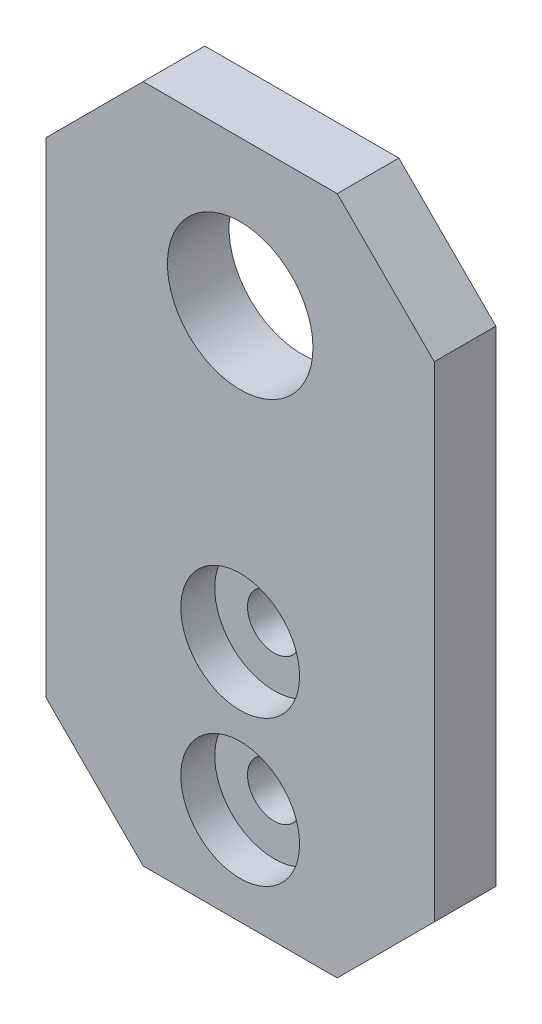
ISO-10303-21;
HEADER;
FILE_DESCRIPTION(('STEP AP214'),'2;1');
FILE_NAME('part.step','',(''),(''),'','','');
FILE_SCHEMA(('AUTOMOTIVE_DESIGN { 1 0 10303 214 1 1 1 1 }'));
ENDSEC;
DATA;
#1=APPLICATION_CONTEXT('core data for automotive mechanical design processes');
#2=APPLICATION_PROTOCOL_DEFINITION('international standard','automotive_design',2000,#1);
#3=PRODUCT_CONTEXT('',#1,'mechanical');
#4=PRODUCT('Part','Part','',(#3));
#5=PRODUCT_RELATED_PRODUCT_CATEGORY('part','',(#4));
#6=PRODUCT_DEFINITION_FORMATION('','',#4);
#7=PRODUCT_DEFINITION_CONTEXT('part definition',#1,'design');
#8=PRODUCT_DEFINITION('design','',#6,#7);
#9=PRODUCT_DEFINITION_SHAPE('','',#8);
#10=(LENGTH_UNIT() NAMED_UNIT(*) SI_UNIT(.MILLI.,.METRE.));
#11=(NAMED_UNIT(*) PLANE_ANGLE_UNIT() SI_UNIT($,.RADIAN.));
#12=(NAMED_UNIT(*) SI_UNIT($,.STERADIAN.) SOLID_ANGLE_UNIT());
#13=UNCERTAINTY_MEASURE_WITH_UNIT(LENGTH_MEASURE(1.E-05),#10,'distance_accuracy_value','');
#14=(GEOMETRIC_REPRESENTATION_CONTEXT(3) GLOBAL_UNCERTAINTY_ASSIGNED_CONTEXT((#13)) GLOBAL_UNIT_ASSIGNED_CONTEXT((#10,
#11,#12)) REPRESENTATION_CONTEXT('',''));
#15=CARTESIAN_POINT('',(0.,0.,0.));
#16=DIRECTION('',(0.,0.,1.));
#17=DIRECTION('',(1.,0.,0.));
#18=AXIS2_PLACEMENT_3D('',#15,#16,#17);
#19=CARTESIAN_POINT('',(0.,0.,6.35));
#20=DIRECTION('',(0.,0.,-1.));
#21=DIRECTION('',(-1.,0.,0.));
#22=AXIS2_PLACEMENT_3D('',#19,#20,#21);
#23=PLANE('',#22);
#24=CARTESIAN_POINT('',(0.,-25.,6.35));
#25=DIRECTION('',(0.,0.,1.));
#26=DIRECTION('',(1.,0.,0.));
#27=AXIS2_PLACEMENT_3D('',#24,#25,#26);
#28=CIRCLE('',#27,6.119);
#29=CARTESIAN_POINT('',(6.119,-25.,6.35));
#30=VERTEX_POINT('',#29);
#31=EDGE_CURVE('E229',#30,#30,#28,.T.);
#32=ORIENTED_EDGE('',*,*,#31,.F.);
#33=EDGE_LOOP('',(#32));
#34=FACE_BOUND('',#33,.T.);
#35=DIRECTION('',(1.,0.,0.));
#36=VECTOR('',#35,1.);
#37=CARTESIAN_POINT('',(-20.,-35.,6.35));
#38=LINE('',#37,#36);
#39=CARTESIAN_POINT('',(-10.,-35.,6.35));
#40=VERTEX_POINT('',#39);
#41=CARTESIAN_POINT('',(9.99999999999997,-35.,6.35));
#42=VERTEX_POINT('',#41);
#43=EDGE_CURVE('E192',#40,#42,#38,.T.);
#44=ORIENTED_EDGE('',*,*,#43,.T.);
#45=DIRECTION('',(-0.707106781186549,-0.707106781186546,0.));
#46=VECTOR('',#45,1.);
#47=CARTESIAN_POINT('',(20.,-25.,6.35));
#48=LINE('',#47,#46);
#49=CARTESIAN_POINT('',(20.,-25.,6.35));
#50=VERTEX_POINT('',#49);
#51=EDGE_CURVE('E178',#42,#50,#48,.F.);
#52=ORIENTED_EDGE('',*,*,#51,.T.);
#53=DIRECTION('',(0.,1.,0.));
#54=VECTOR('',#53,1.);
#55=CARTESIAN_POINT('',(20.,-35.,6.35));
#56=LINE('',#55,#54);
#57=CARTESIAN_POINT('',(20.,24.9999999999999,6.35));
#58=VERTEX_POINT('',#57);
#59=EDGE_CURVE('E135',#50,#58,#56,.T.);
#60=ORIENTED_EDGE('',*,*,#59,.T.);
#61=DIRECTION('',(0.707106781186546,-0.707106781186549,0.));
#62=VECTOR('',#61,1.);
#63=CARTESIAN_POINT('',(9.99999999999999,35.,6.35));
#64=LINE('',#63,#62);
#65=CARTESIAN_POINT('',(9.99999999999999,35.,6.35));
#66=VERTEX_POINT('',#65);
#67=EDGE_CURVE('E70',#58,#66,#64,.F.);
#68=ORIENTED_EDGE('',*,*,#67,.T.);
#69=DIRECTION('',(-1.,0.,0.));
#70=VECTOR('',#69,1.);
#71=CARTESIAN_POINT('',(-20.,35.,6.35));
#72=LINE('',#71,#70);
#73=CARTESIAN_POINT('',(-9.99999999999995,35.,6.35));
#74=VERTEX_POINT('',#73);
#75=EDGE_CURVE('E157',#66,#74,#72,.T.);
#76=ORIENTED_EDGE('',*,*,#75,.T.);
#77=DIRECTION('',(0.707106781186549,0.707106781186546,0.));
#78=VECTOR('',#77,1.);
#79=CARTESIAN_POINT('',(-20.,25.,6.35));
#80=LINE('',#79,#78);
#81=CARTESIAN_POINT('',(-20.,25.,6.35));
#82=VERTEX_POINT('',#81);
#83=EDGE_CURVE('E170',#74,#82,#80,.F.);
#84=ORIENTED_EDGE('',*,*,#83,.T.);
#85=DIRECTION('',(0.,-1.,0.));
#86=VECTOR('',#85,1.);
#87=CARTESIAN_POINT('',(-20.,-35.,6.35));
#88=LINE('',#87,#86);
#89=CARTESIAN_POINT('',(-20.,-25.,6.35));
#90=VERTEX_POINT('',#89);
#91=EDGE_CURVE('E150',#82,#90,#88,.T.);
#92=ORIENTED_EDGE('',*,*,#91,.T.);
#93=DIRECTION('',(-0.707106781186546,0.707106781186549,0.));
#94=VECTOR('',#93,1.);
#95=CARTESIAN_POINT('',(-9.99999999999999,-35.,6.35));
#96=LINE('',#95,#94);
#97=EDGE_CURVE('E175',#90,#40,#96,.F.);
#98=ORIENTED_EDGE('',*,*,#97,.T.);
#99=EDGE_LOOP('',(#44,#52,#60,#68,#76,#84,#92,#98));
#100=FACE_BOUND('',#99,.T.);
#101=CARTESIAN_POINT('',(0.,20.,6.35));
#102=DIRECTION('',(0.,0.,1.));
#103=DIRECTION('',(1.,0.,0.));
#104=AXIS2_PLACEMENT_3D('',#101,#102,#103);
#105=CIRCLE('',#104,7.5);
#106=CARTESIAN_POINT('',(7.5,20.,6.35));
#107=VERTEX_POINT('',#106);
#108=EDGE_CURVE('E206',#107,#107,#105,.T.);
#109=ORIENTED_EDGE('',*,*,#108,.F.);
#110=EDGE_LOOP('',(#109));
#111=FACE_BOUND('',#110,.T.);
#112=CARTESIAN_POINT('',(0.,-10.,6.35));
#113=DIRECTION('',(0.,0.,1.));
#114=DIRECTION('',(1.,0.,0.));
#115=AXIS2_PLACEMENT_3D('',#112,#113,#114);
#116=CIRCLE('',#115,6.119);
#117=CARTESIAN_POINT('',(6.119,-10.,6.35));
#118=VERTEX_POINT('',#117);
#119=EDGE_CURVE('E245',#118,#118,#116,.T.);
#120=ORIENTED_EDGE('',*,*,#119,.F.);
#121=EDGE_LOOP('',(#120));
#122=FACE_BOUND('',#121,.T.);
#123=ADVANCED_FACE('F47',(#34,#100,#111,#122),#23,.F.);
#124=CARTESIAN_POINT('',(0.,0.,0.));
#125=DIRECTION('',(0.,0.,-1.));
#126=DIRECTION('',(-1.,0.,0.));
#127=AXIS2_PLACEMENT_3D('',#124,#125,#126);
#128=PLANE('',#127);
#129=CARTESIAN_POINT('',(0.,-10.,0.));
#130=DIRECTION('',(0.,0.,1.));
#131=DIRECTION('',(1.,0.,0.));
#132=AXIS2_PLACEMENT_3D('',#129,#130,#131);
#133=CIRCLE('',#132,2.75000000000001);
#134=CARTESIAN_POINT('',(2.75000000000002,-10.,0.));
#135=VERTEX_POINT('',#134);
#136=EDGE_CURVE('E233',#135,#135,#133,.T.);
#137=ORIENTED_EDGE('',*,*,#136,.T.);
#138=EDGE_LOOP('',(#137));
#139=FACE_BOUND('',#138,.T.);
#140=CARTESIAN_POINT('',(0.,-25.,0.));
#141=DIRECTION('',(0.,0.,1.));
#142=DIRECTION('',(1.,0.,0.));
#143=AXIS2_PLACEMENT_3D('',#140,#141,#142);
#144=CIRCLE('',#143,2.75000000000001);
#145=CARTESIAN_POINT('',(2.75000000000002,-25.,0.));
#146=VERTEX_POINT('',#145);
#147=EDGE_CURVE('E216',#146,#146,#144,.T.);
#148=ORIENTED_EDGE('',*,*,#147,.T.);
#149=EDGE_LOOP('',(#148));
#150=FACE_BOUND('',#149,.T.);
#151=DIRECTION('',(0.,1.,0.));
#152=VECTOR('',#151,1.);
#153=CARTESIAN_POINT('',(20.,-35.,0.));
#154=LINE('',#153,#152);
#155=CARTESIAN_POINT('',(20.,-25.,0.));
#156=VERTEX_POINT('',#155);
#157=CARTESIAN_POINT('',(20.,24.9999999999999,0.));
#158=VERTEX_POINT('',#157);
#159=EDGE_CURVE('E133',#156,#158,#154,.T.);
#160=ORIENTED_EDGE('',*,*,#159,.F.);
#161=DIRECTION('',(0.707106781186549,0.707106781186546,0.));
#162=VECTOR('',#161,1.);
#163=CARTESIAN_POINT('',(22.5,-22.5,0.));
#164=LINE('',#163,#162);
#165=CARTESIAN_POINT('',(9.99999999999997,-35.,0.));
#166=VERTEX_POINT('',#165);
#167=EDGE_CURVE('E115',#156,#166,#164,.F.);
#168=ORIENTED_EDGE('',*,*,#167,.T.);
#169=DIRECTION('',(1.,0.,0.));
#170=VECTOR('',#169,1.);
#171=CARTESIAN_POINT('',(-20.,-35.,0.));
#172=LINE('',#171,#170);
#173=CARTESIAN_POINT('',(-10.,-35.,0.));
#174=VERTEX_POINT('',#173);
#175=EDGE_CURVE('E146',#174,#166,#172,.T.);
#176=ORIENTED_EDGE('',*,*,#175,.F.);
#177=DIRECTION('',(0.707106781186546,-0.707106781186549,0.));
#178=VECTOR('',#177,1.);
#179=CARTESIAN_POINT('',(-22.5,-22.4999999999999,0.));
#180=LINE('',#179,#178);
#181=CARTESIAN_POINT('',(-20.,-25.,0.));
#182=VERTEX_POINT('',#181);
#183=EDGE_CURVE('E127',#174,#182,#180,.F.);
#184=ORIENTED_EDGE('',*,*,#183,.T.);
#185=DIRECTION('',(0.,-1.,0.));
#186=VECTOR('',#185,1.);
#187=CARTESIAN_POINT('',(-20.,-35.,0.));
#188=LINE('',#187,#186);
#189=CARTESIAN_POINT('',(-20.,25.,0.));
#190=VERTEX_POINT('',#189);
#191=EDGE_CURVE('E152',#190,#182,#188,.T.);
#192=ORIENTED_EDGE('',*,*,#191,.F.);
#193=DIRECTION('',(-0.707106781186549,-0.707106781186546,0.));
#194=VECTOR('',#193,1.);
#195=CARTESIAN_POINT('',(-22.5,22.5,0.));
#196=LINE('',#195,#194);
#197=CARTESIAN_POINT('',(-9.99999999999995,35.,0.));
#198=VERTEX_POINT('',#197);
#199=EDGE_CURVE('E137',#190,#198,#196,.F.);
#200=ORIENTED_EDGE('',*,*,#199,.T.);
#201=DIRECTION('',(-1.,0.,0.));
#202=VECTOR('',#201,1.);
#203=CARTESIAN_POINT('',(-20.,35.,0.));
#204=LINE('',#203,#202);
#205=CARTESIAN_POINT('',(9.99999999999999,35.,0.));
#206=VERTEX_POINT('',#205);
#207=EDGE_CURVE('E145',#206,#198,#204,.T.);
#208=ORIENTED_EDGE('',*,*,#207,.F.);
#209=DIRECTION('',(-0.707106781186546,0.707106781186549,0.));
#210=VECTOR('',#209,1.);
#211=CARTESIAN_POINT('',(22.5,22.4999999999999,0.));
#212=LINE('',#211,#210);
#213=EDGE_CURVE('E143',#206,#158,#212,.F.);
#214=ORIENTED_EDGE('',*,*,#213,.T.);
#215=EDGE_LOOP('',(#160,#168,#176,#184,#192,#200,#208,#214));
#216=FACE_BOUND('',#215,.T.);
#217=CARTESIAN_POINT('',(0.,20.,0.));
#218=DIRECTION('',(0.,0.,1.));
#219=DIRECTION('',(1.,0.,0.));
#220=AXIS2_PLACEMENT_3D('',#217,#218,#219);
#221=CIRCLE('',#220,7.5);
#222=CARTESIAN_POINT('',(7.5,20.,0.));
#223=VERTEX_POINT('',#222);
#224=EDGE_CURVE('E202',#223,#223,#221,.T.);
#225=ORIENTED_EDGE('',*,*,#224,.T.);
#226=EDGE_LOOP('',(#225));
#227=FACE_BOUND('',#226,.T.);
#228=ADVANCED_FACE('F140',(#139,#150,#216,#227),#128,.T.);
#229=CARTESIAN_POINT('',(-20.,-35.,6.35));
#230=DIRECTION('',(1.,0.,0.));
#231=DIRECTION('',(0.,0.,-1.));
#232=AXIS2_PLACEMENT_3D('',#229,#230,#231);
#233=PLANE('',#232);
#234=ORIENTED_EDGE('',*,*,#191,.T.);
#235=DIRECTION('',(0.,0.,1.));
#236=VECTOR('',#235,1.);
#237=CARTESIAN_POINT('',(-20.,-25.,6.35));
#238=LINE('',#237,#236);
#239=EDGE_CURVE('E185',#182,#90,#238,.T.);
#240=ORIENTED_EDGE('',*,*,#239,.T.);
#241=ORIENTED_EDGE('',*,*,#91,.F.);
#242=DIRECTION('',(0.,0.,-1.));
#243=VECTOR('',#242,1.);
#244=CARTESIAN_POINT('',(-20.,25.,6.35));
#245=LINE('',#244,#243);
#246=EDGE_CURVE('E181',#82,#190,#245,.T.);
#247=ORIENTED_EDGE('',*,*,#246,.T.);
#248=EDGE_LOOP('',(#234,#240,#241,#247));
#249=FACE_BOUND('',#248,.T.);
#250=ADVANCED_FACE('F258',(#249),#233,.F.);
#251=CARTESIAN_POINT('',(-20.,-35.,6.35));
#252=DIRECTION('',(0.,1.,0.));
#253=DIRECTION('',(-1.,0.,0.));
#254=AXIS2_PLACEMENT_3D('',#251,#252,#253);
#255=PLANE('',#254);
#256=ORIENTED_EDGE('',*,*,#175,.T.);
#257=DIRECTION('',(0.,0.,1.));
#258=VECTOR('',#257,1.);
#259=CARTESIAN_POINT('',(9.99999999999997,-35.,6.35));
#260=LINE('',#259,#258);
#261=EDGE_CURVE('E120',#166,#42,#260,.T.);
#262=ORIENTED_EDGE('',*,*,#261,.T.);
#263=ORIENTED_EDGE('',*,*,#43,.F.);
#264=DIRECTION('',(0.,0.,-1.));
#265=VECTOR('',#264,1.);
#266=CARTESIAN_POINT('',(-10.,-35.,6.35));
#267=LINE('',#266,#265);
#268=EDGE_CURVE('E126',#40,#174,#267,.T.);
#269=ORIENTED_EDGE('',*,*,#268,.T.);
#270=EDGE_LOOP('',(#256,#262,#263,#269));
#271=FACE_BOUND('',#270,.T.);
#272=ADVANCED_FACE('F271',(#271),#255,.F.);
#273=CARTESIAN_POINT('',(20.,-35.,6.35));
#274=DIRECTION('',(-1.,0.,0.));
#275=DIRECTION('',(0.,-1.,0.));
#276=AXIS2_PLACEMENT_3D('',#273,#274,#275);
#277=PLANE('',#276);
#278=ORIENTED_EDGE('',*,*,#59,.F.);
#279=DIRECTION('',(0.,0.,-1.));
#280=VECTOR('',#279,1.);
#281=CARTESIAN_POINT('',(20.,-25.,6.35));
#282=LINE('',#281,#280);
#283=EDGE_CURVE('E119',#50,#156,#282,.T.);
#284=ORIENTED_EDGE('',*,*,#283,.T.);
#285=ORIENTED_EDGE('',*,*,#159,.T.);
#286=DIRECTION('',(0.,0.,1.));
#287=VECTOR('',#286,1.);
#288=CARTESIAN_POINT('',(20.,24.9999999999999,6.35));
#289=LINE('',#288,#287);
#290=EDGE_CURVE('E138',#158,#58,#289,.T.);
#291=ORIENTED_EDGE('',*,*,#290,.T.);
#292=EDGE_LOOP('',(#278,#284,#285,#291));
#293=FACE_BOUND('',#292,.T.);
#294=ADVANCED_FACE('F132',(#293),#277,.F.);
#295=CARTESIAN_POINT('',(-20.,35.,6.35));
#296=DIRECTION('',(0.,-1.,0.));
#297=DIRECTION('',(0.,0.,-1.));
#298=AXIS2_PLACEMENT_3D('',#295,#296,#297);
#299=PLANE('',#298);
#300=ORIENTED_EDGE('',*,*,#75,.F.);
#301=DIRECTION('',(0.,0.,-1.));
#302=VECTOR('',#301,1.);
#303=CARTESIAN_POINT('',(9.99999999999999,35.,6.35));
#304=LINE('',#303,#302);
#305=EDGE_CURVE('E11',#66,#206,#304,.T.);
#306=ORIENTED_EDGE('',*,*,#305,.T.);
#307=ORIENTED_EDGE('',*,*,#207,.T.);
#308=DIRECTION('',(0.,0.,1.));
#309=VECTOR('',#308,1.);
#310=CARTESIAN_POINT('',(-9.99999999999995,35.,6.35));
#311=LINE('',#310,#309);
#312=EDGE_CURVE('E57',#198,#74,#311,.T.);
#313=ORIENTED_EDGE('',*,*,#312,.T.);
#314=EDGE_LOOP('',(#300,#306,#307,#313));
#315=FACE_BOUND('',#314,.T.);
#316=ADVANCED_FACE('F266',(#315),#299,.F.);
#317=CARTESIAN_POINT('',(0.,20.,6.35));
#318=DIRECTION('',(0.,0.,-1.));
#319=DIRECTION('',(-1.,0.,0.));
#320=AXIS2_PLACEMENT_3D('',#317,#318,#319);
#321=CYLINDRICAL_SURFACE('',#320,7.5);
#322=ORIENTED_EDGE('',*,*,#108,.T.);
#323=EDGE_LOOP('',(#322));
#324=FACE_BOUND('',#323,.T.);
#325=ORIENTED_EDGE('',*,*,#224,.F.);
#326=EDGE_LOOP('',(#325));
#327=FACE_BOUND('',#326,.T.);
#328=ADVANCED_FACE('F263',(#324,#327),#321,.F.);
#329=CARTESIAN_POINT('',(0.,-25.,6.35));
#330=DIRECTION('',(0.,0.,1.));
#331=DIRECTION('',(1.,0.,0.));
#332=AXIS2_PLACEMENT_3D('',#329,#330,#331);
#333=CYLINDRICAL_SURFACE('',#332,2.75);
#334=ORIENTED_EDGE('',*,*,#147,.F.);
#335=EDGE_LOOP('',(#334));
#336=FACE_BOUND('',#335,.T.);
#337=CARTESIAN_POINT('',(0.,-25.,2.85));
#338=DIRECTION('',(0.,0.,1.));
#339=DIRECTION('',(1.,0.,0.));
#340=AXIS2_PLACEMENT_3D('',#337,#338,#339);
#341=CIRCLE('',#340,2.75);
#342=CARTESIAN_POINT('',(2.75000000000001,-25.,2.85));
#343=VERTEX_POINT('',#342);
#344=EDGE_CURVE('E221',#343,#343,#341,.T.);
#345=ORIENTED_EDGE('',*,*,#344,.T.);
#346=EDGE_LOOP('',(#345));
#347=FACE_BOUND('',#346,.T.);
#348=ADVANCED_FACE('F422',(#336,#347),#333,.F.);
#349=CARTESIAN_POINT('',(2.75000000000001,-25.,2.85));
#350=DIRECTION('',(0.,0.,-1.));
#351=DIRECTION('',(-1.,0.,0.));
#352=AXIS2_PLACEMENT_3D('',#349,#350,#351);
#353=PLANE('',#352);
#354=ORIENTED_EDGE('',*,*,#344,.F.);
#355=EDGE_LOOP('',(#354));
#356=FACE_BOUND('',#355,.T.);
#357=CARTESIAN_POINT('',(0.,-25.,2.85));
#358=DIRECTION('',(0.,0.,1.));
#359=DIRECTION('',(1.,0.,0.));
#360=AXIS2_PLACEMENT_3D('',#357,#358,#359);
#361=CIRCLE('',#360,6.119);
#362=CARTESIAN_POINT('',(6.119,-25.,2.85));
#363=VERTEX_POINT('',#362);
#364=EDGE_CURVE('E225',#363,#363,#361,.T.);
#365=ORIENTED_EDGE('',*,*,#364,.T.);
#366=EDGE_LOOP('',(#365));
#367=FACE_BOUND('',#366,.T.);
#368=ADVANCED_FACE('F411',(#356,#367),#353,.F.);
#369=CARTESIAN_POINT('',(0.,-25.,6.35));
#370=DIRECTION('',(0.,0.,1.));
#371=DIRECTION('',(1.,0.,0.));
#372=AXIS2_PLACEMENT_3D('',#369,#370,#371);
#373=CYLINDRICAL_SURFACE('',#372,6.119);
#374=ORIENTED_EDGE('',*,*,#364,.F.);
#375=EDGE_LOOP('',(#374));
#376=FACE_BOUND('',#375,.T.);
#377=ORIENTED_EDGE('',*,*,#31,.T.);
#378=EDGE_LOOP('',(#377));
#379=FACE_BOUND('',#378,.T.);
#380=ADVANCED_FACE('F400',(#376,#379),#373,.F.);
#381=CARTESIAN_POINT('',(0.,-10.,6.35));
#382=DIRECTION('',(0.,0.,1.));
#383=DIRECTION('',(1.,0.,0.));
#384=AXIS2_PLACEMENT_3D('',#381,#382,#383);
#385=CYLINDRICAL_SURFACE('',#384,2.75);
#386=ORIENTED_EDGE('',*,*,#136,.F.);
#387=EDGE_LOOP('',(#386));
#388=FACE_BOUND('',#387,.T.);
#389=CARTESIAN_POINT('',(0.,-10.,2.85));
#390=DIRECTION('',(0.,0.,1.));
#391=DIRECTION('',(1.,0.,0.));
#392=AXIS2_PLACEMENT_3D('',#389,#390,#391);
#393=CIRCLE('',#392,2.75);
#394=CARTESIAN_POINT('',(2.75,-10.,2.85));
#395=VERTEX_POINT('',#394);
#396=EDGE_CURVE('E237',#395,#395,#393,.T.);
#397=ORIENTED_EDGE('',*,*,#396,.T.);
#398=EDGE_LOOP('',(#397));
#399=FACE_BOUND('',#398,.T.);
#400=ADVANCED_FACE('F389',(#388,#399),#385,.F.);
#401=CARTESIAN_POINT('',(2.75,-10.,2.85));
#402=DIRECTION('',(0.,0.,-1.));
#403=DIRECTION('',(-1.,0.,0.));
#404=AXIS2_PLACEMENT_3D('',#401,#402,#403);
#405=PLANE('',#404);
#406=ORIENTED_EDGE('',*,*,#396,.F.);
#407=EDGE_LOOP('',(#406));
#408=FACE_BOUND('',#407,.T.);
#409=CARTESIAN_POINT('',(0.,-10.,2.85));
#410=DIRECTION('',(0.,0.,1.));
#411=DIRECTION('',(1.,0.,0.));
#412=AXIS2_PLACEMENT_3D('',#409,#410,#411);
#413=CIRCLE('',#412,6.119);
#414=CARTESIAN_POINT('',(6.119,-10.,2.85));
#415=VERTEX_POINT('',#414);
#416=EDGE_CURVE('E241',#415,#415,#413,.T.);
#417=ORIENTED_EDGE('',*,*,#416,.T.);
#418=EDGE_LOOP('',(#417));
#419=FACE_BOUND('',#418,.T.);
#420=ADVANCED_FACE('F378',(#408,#419),#405,.F.);
#421=CARTESIAN_POINT('',(0.,-10.,6.35));
#422=DIRECTION('',(0.,0.,1.));
#423=DIRECTION('',(1.,0.,0.));
#424=AXIS2_PLACEMENT_3D('',#421,#422,#423);
#425=CYLINDRICAL_SURFACE('',#424,6.119);
#426=ORIENTED_EDGE('',*,*,#416,.F.);
#427=EDGE_LOOP('',(#426));
#428=FACE_BOUND('',#427,.T.);
#429=ORIENTED_EDGE('',*,*,#119,.T.);
#430=EDGE_LOOP('',(#429));
#431=FACE_BOUND('',#430,.T.);
#432=ADVANCED_FACE('F250',(#428,#431),#425,.F.);
#433=CARTESIAN_POINT('',(20.,-25.,6.35));
#434=DIRECTION('',(-0.707106781186546,0.707106781186549,0.));
#435=DIRECTION('',(0.,0.,-1.));
#436=AXIS2_PLACEMENT_3D('',#433,#434,#435);
#437=PLANE('',#436);
#438=ORIENTED_EDGE('',*,*,#51,.F.);
#439=ORIENTED_EDGE('',*,*,#261,.F.);
#440=ORIENTED_EDGE('',*,*,#167,.F.);
#441=ORIENTED_EDGE('',*,*,#283,.F.);
#442=EDGE_LOOP('',(#438,#439,#440,#441));
#443=FACE_BOUND('',#442,.T.);
#444=ADVANCED_FACE('F118',(#443),#437,.F.);
#445=CARTESIAN_POINT('',(-9.99999999999999,-35.,6.35));
#446=DIRECTION('',(0.707106781186549,0.707106781186546,0.));
#447=DIRECTION('',(0.,0.,-1.));
#448=AXIS2_PLACEMENT_3D('',#445,#446,#447);
#449=PLANE('',#448);
#450=ORIENTED_EDGE('',*,*,#97,.F.);
#451=ORIENTED_EDGE('',*,*,#239,.F.);
#452=ORIENTED_EDGE('',*,*,#183,.F.);
#453=ORIENTED_EDGE('',*,*,#268,.F.);
#454=EDGE_LOOP('',(#450,#451,#452,#453));
#455=FACE_BOUND('',#454,.T.);
#456=ADVANCED_FACE('F283',(#455),#449,.F.);
#457=CARTESIAN_POINT('',(9.99999999999999,35.,6.35));
#458=DIRECTION('',(-0.707106781186549,-0.707106781186546,0.));
#459=DIRECTION('',(0.,0.,-1.));
#460=AXIS2_PLACEMENT_3D('',#457,#458,#459);
#461=PLANE('',#460);
#462=ORIENTED_EDGE('',*,*,#67,.F.);
#463=ORIENTED_EDGE('',*,*,#290,.F.);
#464=ORIENTED_EDGE('',*,*,#213,.F.);
#465=ORIENTED_EDGE('',*,*,#305,.F.);
#466=EDGE_LOOP('',(#462,#463,#464,#465));
#467=FACE_BOUND('',#466,.T.);
#468=ADVANCED_FACE('F288',(#467),#461,.F.);
#469=CARTESIAN_POINT('',(-20.,25.,6.35));
#470=DIRECTION('',(0.707106781186546,-0.707106781186549,0.));
#471=DIRECTION('',(0.,0.,-1.));
#472=AXIS2_PLACEMENT_3D('',#469,#470,#471);
#473=PLANE('',#472);
#474=ORIENTED_EDGE('',*,*,#83,.F.);
#475=ORIENTED_EDGE('',*,*,#312,.F.);
#476=ORIENTED_EDGE('',*,*,#199,.F.);
#477=ORIENTED_EDGE('',*,*,#246,.F.);
#478=EDGE_LOOP('',(#474,#475,#476,#477));
#479=FACE_BOUND('',#478,.T.);
#480=ADVANCED_FACE('F50',(#479),#473,.F.);
#481=CLOSED_SHELL('',(#123,#228,#250,#272,#294,#316,#328,#348,#368,#380,#400,#420,#432,#444,
#456,#468,#480));
#482=MANIFOLD_SOLID_BREP('B2',#481);
#483=ADVANCED_BREP_SHAPE_REPRESENTATION('',(#18,#482),#14);
#484=SHAPE_DEFINITION_REPRESENTATION(#9,#483);
ENDSEC;
END-ISO-10303-21;
